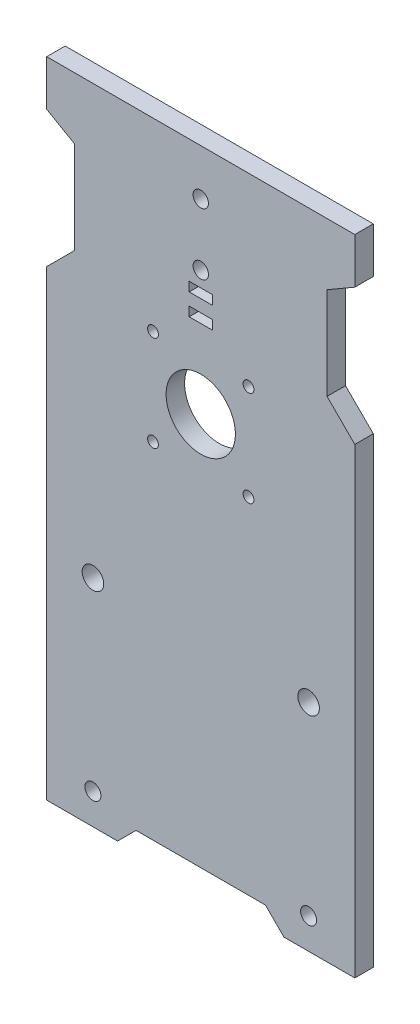
ISO-10303-21;
HEADER;
FILE_DESCRIPTION(('STEP AP214'),'2;1');
FILE_NAME('part.step','',(''),(''),'','','');
FILE_SCHEMA(('AUTOMOTIVE_DESIGN { 1 0 10303 214 1 1 1 1 }'));
ENDSEC;
DATA;
#1=APPLICATION_CONTEXT('core data for automotive mechanical design processes');
#2=APPLICATION_PROTOCOL_DEFINITION('international standard','automotive_design',2000,#1);
#3=PRODUCT_CONTEXT('',#1,'mechanical');
#4=PRODUCT('Part','Part','',(#3));
#5=PRODUCT_RELATED_PRODUCT_CATEGORY('part','',(#4));
#6=PRODUCT_DEFINITION_FORMATION('','',#4);
#7=PRODUCT_DEFINITION_CONTEXT('part definition',#1,'design');
#8=PRODUCT_DEFINITION('design','',#6,#7);
#9=PRODUCT_DEFINITION_SHAPE('','',#8);
#10=(LENGTH_UNIT() NAMED_UNIT(*) SI_UNIT(.MILLI.,.METRE.));
#11=(NAMED_UNIT(*) PLANE_ANGLE_UNIT() SI_UNIT($,.RADIAN.));
#12=(NAMED_UNIT(*) SI_UNIT($,.STERADIAN.) SOLID_ANGLE_UNIT());
#13=UNCERTAINTY_MEASURE_WITH_UNIT(LENGTH_MEASURE(1.E-05),#10,'distance_accuracy_value','');
#14=(GEOMETRIC_REPRESENTATION_CONTEXT(3) GLOBAL_UNCERTAINTY_ASSIGNED_CONTEXT((#13)) GLOBAL_UNIT_ASSIGNED_CONTEXT((#10,
#11,#12)) REPRESENTATION_CONTEXT('',''));
#15=CARTESIAN_POINT('',(0.,0.,0.));
#16=DIRECTION('',(0.,0.,1.));
#17=DIRECTION('',(1.,0.,0.));
#18=AXIS2_PLACEMENT_3D('',#15,#16,#17);
#19=CARTESIAN_POINT('',(0.,0.,6.));
#20=DIRECTION('',(0.,0.,-1.));
#21=DIRECTION('',(-1.,0.,0.));
#22=AXIS2_PLACEMENT_3D('',#19,#20,#21);
#23=PLANE('',#22);
#24=DIRECTION('',(0.,-1.,0.));
#25=VECTOR('',#24,1.);
#26=CARTESIAN_POINT('',(-3.75,54.5,6.));
#27=LINE('',#26,#25);
#28=CARTESIAN_POINT('',(-3.75,57.5,6.));
#29=VERTEX_POINT('',#28);
#30=CARTESIAN_POINT('',(-3.75,54.5,6.));
#31=VERTEX_POINT('',#30);
#32=EDGE_CURVE('E255',#29,#31,#27,.T.);
#33=ORIENTED_EDGE('',*,*,#32,.F.);
#34=DIRECTION('',(-1.,0.,0.));
#35=VECTOR('',#34,1.);
#36=CARTESIAN_POINT('',(-3.75,57.5,6.));
#37=LINE('',#36,#35);
#38=CARTESIAN_POINT('',(3.75,57.5,6.));
#39=VERTEX_POINT('',#38);
#40=EDGE_CURVE('E266',#39,#29,#37,.T.);
#41=ORIENTED_EDGE('',*,*,#40,.F.);
#42=DIRECTION('',(0.,1.,0.));
#43=VECTOR('',#42,1.);
#44=CARTESIAN_POINT('',(3.75,54.5,6.));
#45=LINE('',#44,#43);
#46=CARTESIAN_POINT('',(3.75,54.5,6.));
#47=VERTEX_POINT('',#46);
#48=EDGE_CURVE('E262',#47,#39,#45,.T.);
#49=ORIENTED_EDGE('',*,*,#48,.F.);
#50=DIRECTION('',(1.,0.,0.));
#51=VECTOR('',#50,1.);
#52=CARTESIAN_POINT('',(-3.75,54.5,6.));
#53=LINE('',#52,#51);
#54=EDGE_CURVE('E258',#31,#47,#53,.T.);
#55=ORIENTED_EDGE('',*,*,#54,.F.);
#56=EDGE_LOOP('',(#33,#41,#49,#55));
#57=FACE_BOUND('',#56,.T.);
#58=DIRECTION('',(1.,0.,0.));
#59=VECTOR('',#58,1.);
#60=CARTESIAN_POINT('',(-27.,-104.5,6.));
#61=LINE('',#60,#59);
#62=CARTESIAN_POINT('',(-50.,-104.5,6.));
#63=VERTEX_POINT('',#62);
#64=CARTESIAN_POINT('',(-27.,-104.5,6.));
#65=VERTEX_POINT('',#64);
#66=EDGE_CURVE('E369',#63,#65,#61,.T.);
#67=ORIENTED_EDGE('',*,*,#66,.T.);
#68=DIRECTION('',(0.707106781186547,0.707106781186548,0.));
#69=VECTOR('',#68,1.);
#70=CARTESIAN_POINT('',(-21.,-98.5,6.));
#71=LINE('',#70,#69);
#72=CARTESIAN_POINT('',(-21.,-98.5,6.));
#73=VERTEX_POINT('',#72);
#74=EDGE_CURVE('E373',#65,#73,#71,.T.);
#75=ORIENTED_EDGE('',*,*,#74,.T.);
#76=DIRECTION('',(1.,0.,0.));
#77=VECTOR('',#76,1.);
#78=CARTESIAN_POINT('',(21.,-98.5,6.));
#79=LINE('',#78,#77);
#80=CARTESIAN_POINT('',(21.,-98.5,6.));
#81=VERTEX_POINT('',#80);
#82=EDGE_CURVE('E377',#73,#81,#79,.T.);
#83=ORIENTED_EDGE('',*,*,#82,.T.);
#84=DIRECTION('',(0.707106781186547,-0.707106781186547,0.));
#85=VECTOR('',#84,1.);
#86=CARTESIAN_POINT('',(27.,-104.5,6.));
#87=LINE('',#86,#85);
#88=CARTESIAN_POINT('',(27.,-104.5,6.));
#89=VERTEX_POINT('',#88);
#90=EDGE_CURVE('E380',#81,#89,#87,.T.);
#91=ORIENTED_EDGE('',*,*,#90,.T.);
#92=DIRECTION('',(1.,0.,0.));
#93=VECTOR('',#92,1.);
#94=CARTESIAN_POINT('',(50.,-104.5,6.));
#95=LINE('',#94,#93);
#96=CARTESIAN_POINT('',(50.,-104.5,6.));
#97=VERTEX_POINT('',#96);
#98=EDGE_CURVE('E383',#89,#97,#95,.T.);
#99=ORIENTED_EDGE('',*,*,#98,.T.);
#100=DIRECTION('',(0.,1.,0.));
#101=VECTOR('',#100,1.);
#102=CARTESIAN_POINT('',(50.,45.5,6.));
#103=LINE('',#102,#101);
#104=CARTESIAN_POINT('',(50.,45.5,6.));
#105=VERTEX_POINT('',#104);
#106=EDGE_CURVE('E386',#97,#105,#103,.T.);
#107=ORIENTED_EDGE('',*,*,#106,.T.);
#108=DIRECTION('',(-0.707106781186547,0.707106781186548,0.));
#109=VECTOR('',#108,1.);
#110=CARTESIAN_POINT('',(41.,54.5,6.));
#111=LINE('',#110,#109);
#112=CARTESIAN_POINT('',(41.,54.5,6.));
#113=VERTEX_POINT('',#112);
#114=EDGE_CURVE('E389',#105,#113,#111,.T.);
#115=ORIENTED_EDGE('',*,*,#114,.T.);
#116=DIRECTION('',(0.,1.,0.));
#117=VECTOR('',#116,1.);
#118=CARTESIAN_POINT('',(41.,84.5,6.));
#119=LINE('',#118,#117);
#120=CARTESIAN_POINT('',(41.,84.5,6.));
#121=VERTEX_POINT('',#120);
#122=EDGE_CURVE('E391',#113,#121,#119,.T.);
#123=ORIENTED_EDGE('',*,*,#122,.T.);
#124=DIRECTION('',(0.86602540378444,0.499999999999998,0.));
#125=VECTOR('',#124,1.);
#126=CARTESIAN_POINT('',(50.,89.6961524227066,6.));
#127=LINE('',#126,#125);
#128=CARTESIAN_POINT('',(50.,89.6961524227066,6.));
#129=VERTEX_POINT('',#128);
#130=EDGE_CURVE('E394',#121,#129,#127,.T.);
#131=ORIENTED_EDGE('',*,*,#130,.T.);
#132=DIRECTION('',(0.,1.,0.));
#133=VECTOR('',#132,1.);
#134=CARTESIAN_POINT('',(50.,104.5,6.));
#135=LINE('',#134,#133);
#136=CARTESIAN_POINT('',(50.,104.5,6.));
#137=VERTEX_POINT('',#136);
#138=EDGE_CURVE('E397',#129,#137,#135,.T.);
#139=ORIENTED_EDGE('',*,*,#138,.T.);
#140=DIRECTION('',(-1.,0.,0.));
#141=VECTOR('',#140,1.);
#142=CARTESIAN_POINT('',(-50.,104.5,6.));
#143=LINE('',#142,#141);
#144=CARTESIAN_POINT('',(-50.,104.5,6.));
#145=VERTEX_POINT('',#144);
#146=EDGE_CURVE('E400',#137,#145,#143,.T.);
#147=ORIENTED_EDGE('',*,*,#146,.T.);
#148=DIRECTION('',(0.,-1.,0.));
#149=VECTOR('',#148,1.);
#150=CARTESIAN_POINT('',(-50.,89.6961524227066,6.));
#151=LINE('',#150,#149);
#152=CARTESIAN_POINT('',(-50.,89.6961524227066,6.));
#153=VERTEX_POINT('',#152);
#154=EDGE_CURVE('E403',#145,#153,#151,.T.);
#155=ORIENTED_EDGE('',*,*,#154,.T.);
#156=DIRECTION('',(0.866025403784438,-0.500000000000001,0.));
#157=VECTOR('',#156,1.);
#158=CARTESIAN_POINT('',(-41.,84.5,6.));
#159=LINE('',#158,#157);
#160=CARTESIAN_POINT('',(-41.,84.5,6.));
#161=VERTEX_POINT('',#160);
#162=EDGE_CURVE('E406',#153,#161,#159,.T.);
#163=ORIENTED_EDGE('',*,*,#162,.T.);
#164=DIRECTION('',(0.,-1.,0.));
#165=VECTOR('',#164,1.);
#166=CARTESIAN_POINT('',(-41.,54.5,6.));
#167=LINE('',#166,#165);
#168=CARTESIAN_POINT('',(-41.,54.5,6.));
#169=VERTEX_POINT('',#168);
#170=EDGE_CURVE('E409',#161,#169,#167,.T.);
#171=ORIENTED_EDGE('',*,*,#170,.T.);
#172=DIRECTION('',(-0.707106781186547,-0.707106781186548,0.));
#173=VECTOR('',#172,1.);
#174=CARTESIAN_POINT('',(-50.,45.5,6.));
#175=LINE('',#174,#173);
#176=CARTESIAN_POINT('',(-50.,45.5,6.));
#177=VERTEX_POINT('',#176);
#178=EDGE_CURVE('E412',#169,#177,#175,.T.);
#179=ORIENTED_EDGE('',*,*,#178,.T.);
#180=DIRECTION('',(0.,-1.,0.));
#181=VECTOR('',#180,1.);
#182=CARTESIAN_POINT('',(-50.,-104.5,6.));
#183=LINE('',#182,#181);
#184=EDGE_CURVE('E415',#177,#63,#183,.T.);
#185=ORIENTED_EDGE('',*,*,#184,.T.);
#186=EDGE_LOOP('',(#67,#75,#83,#91,#99,#107,#115,#123,#131,#139,#147,#155,#163,#171,#179,#185));
#187=FACE_BOUND('',#186,.T.);
#188=CARTESIAN_POINT('',(-35.,-94.5,6.));
#189=DIRECTION('',(0.,0.,1.));
#190=DIRECTION('',(1.,0.,0.));
#191=AXIS2_PLACEMENT_3D('',#188,#189,#190);
#192=CIRCLE('',#191,2.6);
#193=CARTESIAN_POINT('',(-32.4,-94.5,6.));
#194=VERTEX_POINT('',#193);
#195=EDGE_CURVE('E361',#194,#194,#192,.T.);
#196=ORIENTED_EDGE('',*,*,#195,.F.);
#197=EDGE_LOOP('',(#196));
#198=FACE_BOUND('',#197,.T.);
#199=CARTESIAN_POINT('',(-35.,-34.5,6.));
#200=DIRECTION('',(0.,0.,1.));
#201=DIRECTION('',(1.,0.,0.));
#202=AXIS2_PLACEMENT_3D('',#199,#200,#201);
#203=CIRCLE('',#202,3.5);
#204=CARTESIAN_POINT('',(-31.5,-34.5,6.));
#205=VERTEX_POINT('',#204);
#206=EDGE_CURVE('E353',#205,#205,#203,.T.);
#207=ORIENTED_EDGE('',*,*,#206,.F.);
#208=EDGE_LOOP('',(#207));
#209=FACE_BOUND('',#208,.T.);
#210=CARTESIAN_POINT('',(35.,-34.5,6.));
#211=DIRECTION('',(0.,0.,1.));
#212=DIRECTION('',(1.,0.,0.));
#213=AXIS2_PLACEMENT_3D('',#210,#211,#212);
#214=CIRCLE('',#213,3.50000000000001);
#215=CARTESIAN_POINT('',(38.5,-34.5,6.));
#216=VERTEX_POINT('',#215);
#217=EDGE_CURVE('E345',#216,#216,#214,.T.);
#218=ORIENTED_EDGE('',*,*,#217,.F.);
#219=EDGE_LOOP('',(#218));
#220=FACE_BOUND('',#219,.T.);
#221=CARTESIAN_POINT('',(35.,-94.5,6.));
#222=DIRECTION('',(0.,0.,1.));
#223=DIRECTION('',(1.,0.,0.));
#224=AXIS2_PLACEMENT_3D('',#221,#222,#223);
#225=CIRCLE('',#224,2.6);
#226=CARTESIAN_POINT('',(37.6,-94.5,6.));
#227=VERTEX_POINT('',#226);
#228=EDGE_CURVE('E337',#227,#227,#225,.T.);
#229=ORIENTED_EDGE('',*,*,#228,.F.);
#230=EDGE_LOOP('',(#229));
#231=FACE_BOUND('',#230,.T.);
#232=CARTESIAN_POINT('',(-15.5,13.5,6.));
#233=DIRECTION('',(0.,0.,1.));
#234=DIRECTION('',(1.,0.,0.));
#235=AXIS2_PLACEMENT_3D('',#232,#233,#234);
#236=CIRCLE('',#235,1.75);
#237=CARTESIAN_POINT('',(-13.75,13.5,6.));
#238=VERTEX_POINT('',#237);
#239=EDGE_CURVE('E329',#238,#238,#236,.T.);
#240=ORIENTED_EDGE('',*,*,#239,.F.);
#241=EDGE_LOOP('',(#240));
#242=FACE_BOUND('',#241,.T.);
#243=CARTESIAN_POINT('',(15.5,13.5,6.));
#244=DIRECTION('',(0.,0.,1.));
#245=DIRECTION('',(1.,0.,0.));
#246=AXIS2_PLACEMENT_3D('',#243,#244,#245);
#247=CIRCLE('',#246,1.75000000000001);
#248=CARTESIAN_POINT('',(17.25,13.5,6.));
#249=VERTEX_POINT('',#248);
#250=EDGE_CURVE('E321',#249,#249,#247,.T.);
#251=ORIENTED_EDGE('',*,*,#250,.F.);
#252=EDGE_LOOP('',(#251));
#253=FACE_BOUND('',#252,.T.);
#254=CARTESIAN_POINT('',(0.,29.,6.));
#255=DIRECTION('',(0.,0.,1.));
#256=DIRECTION('',(1.,0.,0.));
#257=AXIS2_PLACEMENT_3D('',#254,#255,#256);
#258=CIRCLE('',#257,11.25);
#259=CARTESIAN_POINT('',(11.25,29.,6.));
#260=VERTEX_POINT('',#259);
#261=EDGE_CURVE('E314',#260,#260,#258,.T.);
#262=ORIENTED_EDGE('',*,*,#261,.F.);
#263=EDGE_LOOP('',(#262));
#264=FACE_BOUND('',#263,.T.);
#265=CARTESIAN_POINT('',(15.5,44.5,6.));
#266=DIRECTION('',(0.,0.,1.));
#267=DIRECTION('',(1.,0.,0.));
#268=AXIS2_PLACEMENT_3D('',#265,#266,#267);
#269=CIRCLE('',#268,1.75000000000001);
#270=CARTESIAN_POINT('',(17.25,44.5,6.));
#271=VERTEX_POINT('',#270);
#272=EDGE_CURVE('E306',#271,#271,#269,.T.);
#273=ORIENTED_EDGE('',*,*,#272,.F.);
#274=EDGE_LOOP('',(#273));
#275=FACE_BOUND('',#274,.T.);
#276=CARTESIAN_POINT('',(-15.5,44.5,6.));
#277=DIRECTION('',(0.,0.,1.));
#278=DIRECTION('',(1.,0.,0.));
#279=AXIS2_PLACEMENT_3D('',#276,#277,#278);
#280=CIRCLE('',#279,1.75);
#281=CARTESIAN_POINT('',(-13.75,44.5,6.));
#282=VERTEX_POINT('',#281);
#283=EDGE_CURVE('E298',#282,#282,#280,.T.);
#284=ORIENTED_EDGE('',*,*,#283,.F.);
#285=EDGE_LOOP('',(#284));
#286=FACE_BOUND('',#285,.T.);
#287=DIRECTION('',(0.,-1.,0.));
#288=VECTOR('',#287,1.);
#289=CARTESIAN_POINT('',(-3.75,61.5,6.));
#290=LINE('',#289,#288);
#291=CARTESIAN_POINT('',(-3.75,64.5,6.));
#292=VERTEX_POINT('',#291);
#293=CARTESIAN_POINT('',(-3.75,61.5,6.));
#294=VERTEX_POINT('',#293);
#295=EDGE_CURVE('E202',#292,#294,#290,.T.);
#296=ORIENTED_EDGE('',*,*,#295,.F.);
#297=DIRECTION('',(-1.,0.,0.));
#298=VECTOR('',#297,1.);
#299=CARTESIAN_POINT('',(-3.75,64.5,6.));
#300=LINE('',#299,#298);
#301=CARTESIAN_POINT('',(3.75,64.5,6.));
#302=VERTEX_POINT('',#301);
#303=EDGE_CURVE('E231',#302,#292,#300,.T.);
#304=ORIENTED_EDGE('',*,*,#303,.F.);
#305=DIRECTION('',(0.,1.,0.));
#306=VECTOR('',#305,1.);
#307=CARTESIAN_POINT('',(3.75,61.5,6.));
#308=LINE('',#307,#306);
#309=CARTESIAN_POINT('',(3.75,61.5,6.));
#310=VERTEX_POINT('',#309);
#311=EDGE_CURVE('E225',#310,#302,#308,.T.);
#312=ORIENTED_EDGE('',*,*,#311,.F.);
#313=DIRECTION('',(1.,0.,0.));
#314=VECTOR('',#313,1.);
#315=CARTESIAN_POINT('',(-3.75,61.5,6.));
#316=LINE('',#315,#314);
#317=EDGE_CURVE('E211',#294,#310,#316,.T.);
#318=ORIENTED_EDGE('',*,*,#317,.F.);
#319=EDGE_LOOP('',(#296,#304,#312,#318));
#320=FACE_BOUND('',#319,.T.);
#321=CARTESIAN_POINT('',(0.,69.5,6.));
#322=DIRECTION('',(0.,0.,1.));
#323=DIRECTION('',(1.,0.,0.));
#324=AXIS2_PLACEMENT_3D('',#321,#322,#323);
#325=CIRCLE('',#324,2.5);
#326=CARTESIAN_POINT('',(2.5,69.5,6.));
#327=VERTEX_POINT('',#326);
#328=EDGE_CURVE('E239',#327,#327,#325,.T.);
#329=ORIENTED_EDGE('',*,*,#328,.F.);
#330=EDGE_LOOP('',(#329));
#331=FACE_BOUND('',#330,.T.);
#332=CARTESIAN_POINT('',(0.,89.5,6.));
#333=DIRECTION('',(0.,0.,1.));
#334=DIRECTION('',(1.,0.,0.));
#335=AXIS2_PLACEMENT_3D('',#332,#333,#334);
#336=CIRCLE('',#335,2.5);
#337=CARTESIAN_POINT('',(2.5,89.5,6.));
#338=VERTEX_POINT('',#337);
#339=EDGE_CURVE('E804',#338,#338,#336,.T.);
#340=ORIENTED_EDGE('',*,*,#339,.F.);
#341=EDGE_LOOP('',(#340));
#342=FACE_BOUND('',#341,.T.);
#343=ADVANCED_FACE('F40',(#57,#187,#198,#209,#220,#231,#242,#253,#264,#275,#286,#320,#331,#342),
#23,.F.);
#344=CARTESIAN_POINT('',(0.,0.,0.));
#345=DIRECTION('',(0.,0.,-1.));
#346=DIRECTION('',(-1.,0.,0.));
#347=AXIS2_PLACEMENT_3D('',#344,#345,#346);
#348=PLANE('',#347);
#349=CARTESIAN_POINT('',(0.,69.5,0.));
#350=DIRECTION('',(0.,0.,1.));
#351=DIRECTION('',(1.,0.,0.));
#352=AXIS2_PLACEMENT_3D('',#349,#350,#351);
#353=CIRCLE('',#352,2.5);
#354=CARTESIAN_POINT('',(2.5,69.5,0.));
#355=VERTEX_POINT('',#354);
#356=EDGE_CURVE('E808',#355,#355,#353,.T.);
#357=ORIENTED_EDGE('',*,*,#356,.T.);
#358=EDGE_LOOP('',(#357));
#359=FACE_BOUND('',#358,.T.);
#360=CARTESIAN_POINT('',(15.5,44.5,0.));
#361=DIRECTION('',(0.,0.,1.));
#362=DIRECTION('',(1.,0.,0.));
#363=AXIS2_PLACEMENT_3D('',#360,#361,#362);
#364=CIRCLE('',#363,1.75000000000001);
#365=CARTESIAN_POINT('',(17.25,44.5,0.));
#366=VERTEX_POINT('',#365);
#367=EDGE_CURVE('E302',#366,#366,#364,.T.);
#368=ORIENTED_EDGE('',*,*,#367,.T.);
#369=EDGE_LOOP('',(#368));
#370=FACE_BOUND('',#369,.T.);
#371=CARTESIAN_POINT('',(15.5,13.5,0.));
#372=DIRECTION('',(0.,0.,1.));
#373=DIRECTION('',(1.,0.,0.));
#374=AXIS2_PLACEMENT_3D('',#371,#372,#373);
#375=CIRCLE('',#374,1.75000000000001);
#376=CARTESIAN_POINT('',(17.25,13.5,0.));
#377=VERTEX_POINT('',#376);
#378=EDGE_CURVE('E318',#377,#377,#375,.T.);
#379=ORIENTED_EDGE('',*,*,#378,.T.);
#380=EDGE_LOOP('',(#379));
#381=FACE_BOUND('',#380,.T.);
#382=CARTESIAN_POINT('',(35.,-94.5,0.));
#383=DIRECTION('',(0.,0.,1.));
#384=DIRECTION('',(1.,0.,0.));
#385=AXIS2_PLACEMENT_3D('',#382,#383,#384);
#386=CIRCLE('',#385,2.6);
#387=CARTESIAN_POINT('',(37.6,-94.5,0.));
#388=VERTEX_POINT('',#387);
#389=EDGE_CURVE('E333',#388,#388,#386,.T.);
#390=ORIENTED_EDGE('',*,*,#389,.T.);
#391=EDGE_LOOP('',(#390));
#392=FACE_BOUND('',#391,.T.);
#393=CARTESIAN_POINT('',(-35.,-34.5,0.));
#394=DIRECTION('',(0.,0.,1.));
#395=DIRECTION('',(1.,0.,0.));
#396=AXIS2_PLACEMENT_3D('',#393,#394,#395);
#397=CIRCLE('',#396,3.5);
#398=CARTESIAN_POINT('',(-31.5,-34.5,0.));
#399=VERTEX_POINT('',#398);
#400=EDGE_CURVE('E349',#399,#399,#397,.T.);
#401=ORIENTED_EDGE('',*,*,#400,.T.);
#402=EDGE_LOOP('',(#401));
#403=FACE_BOUND('',#402,.T.);
#404=DIRECTION('',(1.,0.,0.));
#405=VECTOR('',#404,1.);
#406=CARTESIAN_POINT('',(-27.,-104.5,0.));
#407=LINE('',#406,#405);
#408=CARTESIAN_POINT('',(-50.,-104.5,0.));
#409=VERTEX_POINT('',#408);
#410=CARTESIAN_POINT('',(-27.,-104.5,0.));
#411=VERTEX_POINT('',#410);
#412=EDGE_CURVE('E365',#409,#411,#407,.T.);
#413=ORIENTED_EDGE('',*,*,#412,.F.);
#414=DIRECTION('',(0.,-1.,0.));
#415=VECTOR('',#414,1.);
#416=CARTESIAN_POINT('',(-50.,-104.5,0.));
#417=LINE('',#416,#415);
#418=CARTESIAN_POINT('',(-50.,45.5,0.));
#419=VERTEX_POINT('',#418);
#420=EDGE_CURVE('E374',#419,#409,#417,.T.);
#421=ORIENTED_EDGE('',*,*,#420,.F.);
#422=DIRECTION('',(-0.707106781186547,-0.707106781186548,0.));
#423=VECTOR('',#422,1.);
#424=CARTESIAN_POINT('',(-50.,45.5,0.));
#425=LINE('',#424,#423);
#426=CARTESIAN_POINT('',(-41.,54.5,0.));
#427=VERTEX_POINT('',#426);
#428=EDGE_CURVE('E461',#427,#419,#425,.T.);
#429=ORIENTED_EDGE('',*,*,#428,.F.);
#430=DIRECTION('',(0.,-1.,0.));
#431=VECTOR('',#430,1.);
#432=CARTESIAN_POINT('',(-41.,54.5,0.));
#433=LINE('',#432,#431);
#434=CARTESIAN_POINT('',(-41.,84.5,0.));
#435=VERTEX_POINT('',#434);
#436=EDGE_CURVE('E458',#435,#427,#433,.T.);
#437=ORIENTED_EDGE('',*,*,#436,.F.);
#438=DIRECTION('',(0.866025403784438,-0.500000000000001,0.));
#439=VECTOR('',#438,1.);
#440=CARTESIAN_POINT('',(-41.,84.5,0.));
#441=LINE('',#440,#439);
#442=CARTESIAN_POINT('',(-50.,89.6961524227066,0.));
#443=VERTEX_POINT('',#442);
#444=EDGE_CURVE('E455',#443,#435,#441,.T.);
#445=ORIENTED_EDGE('',*,*,#444,.F.);
#446=DIRECTION('',(0.,-1.,0.));
#447=VECTOR('',#446,1.);
#448=CARTESIAN_POINT('',(-50.,89.6961524227066,0.));
#449=LINE('',#448,#447);
#450=CARTESIAN_POINT('',(-50.,104.5,0.));
#451=VERTEX_POINT('',#450);
#452=EDGE_CURVE('E452',#451,#443,#449,.T.);
#453=ORIENTED_EDGE('',*,*,#452,.F.);
#454=DIRECTION('',(-1.,0.,0.));
#455=VECTOR('',#454,1.);
#456=CARTESIAN_POINT('',(-50.,104.5,0.));
#457=LINE('',#456,#455);
#458=CARTESIAN_POINT('',(50.,104.5,0.));
#459=VERTEX_POINT('',#458);
#460=EDGE_CURVE('E449',#459,#451,#457,.T.);
#461=ORIENTED_EDGE('',*,*,#460,.F.);
#462=DIRECTION('',(0.,1.,0.));
#463=VECTOR('',#462,1.);
#464=CARTESIAN_POINT('',(50.,104.5,0.));
#465=LINE('',#464,#463);
#466=CARTESIAN_POINT('',(50.,89.6961524227066,0.));
#467=VERTEX_POINT('',#466);
#468=EDGE_CURVE('E446',#467,#459,#465,.T.);
#469=ORIENTED_EDGE('',*,*,#468,.F.);
#470=DIRECTION('',(0.86602540378444,0.499999999999998,0.));
#471=VECTOR('',#470,1.);
#472=CARTESIAN_POINT('',(50.,89.6961524227066,0.));
#473=LINE('',#472,#471);
#474=CARTESIAN_POINT('',(41.,84.5,0.));
#475=VERTEX_POINT('',#474);
#476=EDGE_CURVE('E443',#475,#467,#473,.T.);
#477=ORIENTED_EDGE('',*,*,#476,.F.);
#478=DIRECTION('',(0.,1.,0.));
#479=VECTOR('',#478,1.);
#480=CARTESIAN_POINT('',(41.,84.5,0.));
#481=LINE('',#480,#479);
#482=CARTESIAN_POINT('',(41.,54.5,0.));
#483=VERTEX_POINT('',#482);
#484=EDGE_CURVE('E440',#483,#475,#481,.T.);
#485=ORIENTED_EDGE('',*,*,#484,.F.);
#486=DIRECTION('',(-0.707106781186547,0.707106781186548,0.));
#487=VECTOR('',#486,1.);
#488=CARTESIAN_POINT('',(41.,54.5,0.));
#489=LINE('',#488,#487);
#490=CARTESIAN_POINT('',(50.,45.5,0.));
#491=VERTEX_POINT('',#490);
#492=EDGE_CURVE('E437',#491,#483,#489,.T.);
#493=ORIENTED_EDGE('',*,*,#492,.F.);
#494=DIRECTION('',(0.,1.,0.));
#495=VECTOR('',#494,1.);
#496=CARTESIAN_POINT('',(50.,45.5,0.));
#497=LINE('',#496,#495);
#498=CARTESIAN_POINT('',(50.,-104.5,0.));
#499=VERTEX_POINT('',#498);
#500=EDGE_CURVE('E434',#499,#491,#497,.T.);
#501=ORIENTED_EDGE('',*,*,#500,.F.);
#502=DIRECTION('',(1.,0.,0.));
#503=VECTOR('',#502,1.);
#504=CARTESIAN_POINT('',(50.,-104.5,0.));
#505=LINE('',#504,#503);
#506=CARTESIAN_POINT('',(27.,-104.5,0.));
#507=VERTEX_POINT('',#506);
#508=EDGE_CURVE('E431',#507,#499,#505,.T.);
#509=ORIENTED_EDGE('',*,*,#508,.F.);
#510=DIRECTION('',(0.707106781186547,-0.707106781186547,0.));
#511=VECTOR('',#510,1.);
#512=CARTESIAN_POINT('',(27.,-104.5,0.));
#513=LINE('',#512,#511);
#514=CARTESIAN_POINT('',(21.,-98.5,0.));
#515=VERTEX_POINT('',#514);
#516=EDGE_CURVE('E428',#515,#507,#513,.T.);
#517=ORIENTED_EDGE('',*,*,#516,.F.);
#518=DIRECTION('',(1.,0.,0.));
#519=VECTOR('',#518,1.);
#520=CARTESIAN_POINT('',(21.,-98.5,0.));
#521=LINE('',#520,#519);
#522=CARTESIAN_POINT('',(-21.,-98.5,0.));
#523=VERTEX_POINT('',#522);
#524=EDGE_CURVE('E425',#523,#515,#521,.T.);
#525=ORIENTED_EDGE('',*,*,#524,.F.);
#526=DIRECTION('',(0.707106781186547,0.707106781186548,0.));
#527=VECTOR('',#526,1.);
#528=CARTESIAN_POINT('',(-21.,-98.5,0.));
#529=LINE('',#528,#527);
#530=EDGE_CURVE('E422',#411,#523,#529,.T.);
#531=ORIENTED_EDGE('',*,*,#530,.F.);
#532=EDGE_LOOP('',(#413,#421,#429,#437,#445,#453,#461,#469,#477,#485,#493,#501,#509,#517,#525,#531));
#533=FACE_BOUND('',#532,.T.);
#534=CARTESIAN_POINT('',(-35.,-94.5,0.));
#535=DIRECTION('',(0.,0.,1.));
#536=DIRECTION('',(1.,0.,0.));
#537=AXIS2_PLACEMENT_3D('',#534,#535,#536);
#538=CIRCLE('',#537,2.6);
#539=CARTESIAN_POINT('',(-32.4,-94.5,0.));
#540=VERTEX_POINT('',#539);
#541=EDGE_CURVE('E357',#540,#540,#538,.T.);
#542=ORIENTED_EDGE('',*,*,#541,.T.);
#543=EDGE_LOOP('',(#542));
#544=FACE_BOUND('',#543,.T.);
#545=CARTESIAN_POINT('',(35.,-34.5,0.));
#546=DIRECTION('',(0.,0.,1.));
#547=DIRECTION('',(1.,0.,0.));
#548=AXIS2_PLACEMENT_3D('',#545,#546,#547);
#549=CIRCLE('',#548,3.50000000000001);
#550=CARTESIAN_POINT('',(38.5,-34.5,0.));
#551=VERTEX_POINT('',#550);
#552=EDGE_CURVE('E341',#551,#551,#549,.T.);
#553=ORIENTED_EDGE('',*,*,#552,.T.);
#554=EDGE_LOOP('',(#553));
#555=FACE_BOUND('',#554,.T.);
#556=CARTESIAN_POINT('',(-15.5,13.5,0.));
#557=DIRECTION('',(0.,0.,1.));
#558=DIRECTION('',(1.,0.,0.));
#559=AXIS2_PLACEMENT_3D('',#556,#557,#558);
#560=CIRCLE('',#559,1.75);
#561=CARTESIAN_POINT('',(-13.75,13.5,0.));
#562=VERTEX_POINT('',#561);
#563=EDGE_CURVE('E325',#562,#562,#560,.T.);
#564=ORIENTED_EDGE('',*,*,#563,.T.);
#565=EDGE_LOOP('',(#564));
#566=FACE_BOUND('',#565,.T.);
#567=CARTESIAN_POINT('',(0.,29.,0.));
#568=DIRECTION('',(0.,0.,1.));
#569=DIRECTION('',(1.,0.,0.));
#570=AXIS2_PLACEMENT_3D('',#567,#568,#569);
#571=CIRCLE('',#570,11.25);
#572=CARTESIAN_POINT('',(11.25,29.,0.));
#573=VERTEX_POINT('',#572);
#574=EDGE_CURVE('E310',#573,#573,#571,.T.);
#575=ORIENTED_EDGE('',*,*,#574,.T.);
#576=EDGE_LOOP('',(#575));
#577=FACE_BOUND('',#576,.T.);
#578=CARTESIAN_POINT('',(-15.5,44.5,0.));
#579=DIRECTION('',(0.,0.,1.));
#580=DIRECTION('',(1.,0.,0.));
#581=AXIS2_PLACEMENT_3D('',#578,#579,#580);
#582=CIRCLE('',#581,1.75);
#583=CARTESIAN_POINT('',(-13.75,44.5,0.));
#584=VERTEX_POINT('',#583);
#585=EDGE_CURVE('E297',#584,#584,#582,.T.);
#586=ORIENTED_EDGE('',*,*,#585,.T.);
#587=EDGE_LOOP('',(#586));
#588=FACE_BOUND('',#587,.T.);
#589=DIRECTION('',(-1.,0.,0.));
#590=VECTOR('',#589,1.);
#591=CARTESIAN_POINT('',(-3.75,57.5,0.));
#592=LINE('',#591,#590);
#593=CARTESIAN_POINT('',(3.75,57.5,0.));
#594=VERTEX_POINT('',#593);
#595=CARTESIAN_POINT('',(-3.75,57.5,0.));
#596=VERTEX_POINT('',#595);
#597=EDGE_CURVE('E259',#594,#596,#592,.T.);
#598=ORIENTED_EDGE('',*,*,#597,.T.);
#599=DIRECTION('',(0.,-1.,0.));
#600=VECTOR('',#599,1.);
#601=CARTESIAN_POINT('',(-3.75,54.5,0.));
#602=LINE('',#601,#600);
#603=CARTESIAN_POINT('',(-3.75,54.5,0.));
#604=VERTEX_POINT('',#603);
#605=EDGE_CURVE('E220',#596,#604,#602,.T.);
#606=ORIENTED_EDGE('',*,*,#605,.T.);
#607=DIRECTION('',(1.,0.,0.));
#608=VECTOR('',#607,1.);
#609=CARTESIAN_POINT('',(-3.75,54.5,0.));
#610=LINE('',#609,#608);
#611=CARTESIAN_POINT('',(3.75,54.5,0.));
#612=VERTEX_POINT('',#611);
#613=EDGE_CURVE('E273',#604,#612,#610,.T.);
#614=ORIENTED_EDGE('',*,*,#613,.T.);
#615=DIRECTION('',(0.,1.,0.));
#616=VECTOR('',#615,1.);
#617=CARTESIAN_POINT('',(3.75,54.5,0.));
#618=LINE('',#617,#616);
#619=EDGE_CURVE('E277',#612,#594,#618,.T.);
#620=ORIENTED_EDGE('',*,*,#619,.T.);
#621=EDGE_LOOP('',(#598,#606,#614,#620));
#622=FACE_BOUND('',#621,.T.);
#623=DIRECTION('',(-1.,0.,0.));
#624=VECTOR('',#623,1.);
#625=CARTESIAN_POINT('',(-3.75,64.5,0.));
#626=LINE('',#625,#624);
#627=CARTESIAN_POINT('',(3.75,64.5,0.));
#628=VERTEX_POINT('',#627);
#629=CARTESIAN_POINT('',(-3.75,64.5,0.));
#630=VERTEX_POINT('',#629);
#631=EDGE_CURVE('E212',#628,#630,#626,.T.);
#632=ORIENTED_EDGE('',*,*,#631,.T.);
#633=DIRECTION('',(0.,-1.,0.));
#634=VECTOR('',#633,1.);
#635=CARTESIAN_POINT('',(-3.75,61.5,0.));
#636=LINE('',#635,#634);
#637=CARTESIAN_POINT('',(-3.75,61.5,0.));
#638=VERTEX_POINT('',#637);
#639=EDGE_CURVE('E64',#630,#638,#636,.T.);
#640=ORIENTED_EDGE('',*,*,#639,.T.);
#641=DIRECTION('',(1.,0.,0.));
#642=VECTOR('',#641,1.);
#643=CARTESIAN_POINT('',(-3.75,61.5,0.));
#644=LINE('',#643,#642);
#645=CARTESIAN_POINT('',(3.75,61.5,0.));
#646=VERTEX_POINT('',#645);
#647=EDGE_CURVE('E218',#638,#646,#644,.T.);
#648=ORIENTED_EDGE('',*,*,#647,.T.);
#649=DIRECTION('',(0.,1.,0.));
#650=VECTOR('',#649,1.);
#651=CARTESIAN_POINT('',(3.75,61.5,0.));
#652=LINE('',#651,#650);
#653=EDGE_CURVE('E242',#646,#628,#652,.T.);
#654=ORIENTED_EDGE('',*,*,#653,.T.);
#655=EDGE_LOOP('',(#632,#640,#648,#654));
#656=FACE_BOUND('',#655,.T.);
#657=CARTESIAN_POINT('',(0.,89.5,0.));
#658=DIRECTION('',(0.,0.,1.));
#659=DIRECTION('',(1.,0.,0.));
#660=AXIS2_PLACEMENT_3D('',#657,#658,#659);
#661=CIRCLE('',#660,2.5);
#662=CARTESIAN_POINT('',(2.5,89.5,0.));
#663=VERTEX_POINT('',#662);
#664=EDGE_CURVE('E809',#663,#663,#661,.T.);
#665=ORIENTED_EDGE('',*,*,#664,.T.);
#666=EDGE_LOOP('',(#665));
#667=FACE_BOUND('',#666,.T.);
#668=ADVANCED_FACE('F532',(#359,#370,#381,#392,#403,#533,#544,#555,#566,#577,#588,#622,#656,
#667),#348,.T.);
#669=CARTESIAN_POINT('',(-27.,-104.5,6.));
#670=DIRECTION('',(0.,1.,0.));
#671=DIRECTION('',(0.,0.,1.));
#672=AXIS2_PLACEMENT_3D('',#669,#670,#671);
#673=PLANE('',#672);
#674=ORIENTED_EDGE('',*,*,#412,.T.);
#675=DIRECTION('',(0.,0.,-1.));
#676=VECTOR('',#675,1.);
#677=CARTESIAN_POINT('',(-27.,-104.5,6.));
#678=LINE('',#677,#676);
#679=EDGE_CURVE('E11',#65,#411,#678,.T.);
#680=ORIENTED_EDGE('',*,*,#679,.F.);
#681=ORIENTED_EDGE('',*,*,#66,.F.);
#682=DIRECTION('',(0.,0.,-1.));
#683=VECTOR('',#682,1.);
#684=CARTESIAN_POINT('',(-50.,-104.5,6.));
#685=LINE('',#684,#683);
#686=EDGE_CURVE('E418',#63,#409,#685,.T.);
#687=ORIENTED_EDGE('',*,*,#686,.T.);
#688=EDGE_LOOP('',(#674,#680,#681,#687));
#689=FACE_BOUND('',#688,.T.);
#690=ADVANCED_FACE('F42',(#689),#673,.F.);
#691=CARTESIAN_POINT('',(-21.,-98.5,6.));
#692=DIRECTION('',(-0.707106781186548,0.707106781186547,0.));
#693=DIRECTION('',(-0.707106781186547,-0.707106781186548,0.));
#694=AXIS2_PLACEMENT_3D('',#691,#692,#693);
#695=PLANE('',#694);
#696=ORIENTED_EDGE('',*,*,#530,.T.);
#697=DIRECTION('',(0.,0.,-1.));
#698=VECTOR('',#697,1.);
#699=CARTESIAN_POINT('',(-21.,-98.5,6.));
#700=LINE('',#699,#698);
#701=EDGE_CURVE('E49',#73,#523,#700,.T.);
#702=ORIENTED_EDGE('',*,*,#701,.F.);
#703=ORIENTED_EDGE('',*,*,#74,.F.);
#704=ORIENTED_EDGE('',*,*,#679,.T.);
#705=EDGE_LOOP('',(#696,#702,#703,#704));
#706=FACE_BOUND('',#705,.T.);
#707=ADVANCED_FACE('F550',(#706),#695,.F.);
#708=CARTESIAN_POINT('',(21.,-98.5,6.));
#709=DIRECTION('',(0.,1.,0.));
#710=DIRECTION('',(0.,0.,1.));
#711=AXIS2_PLACEMENT_3D('',#708,#709,#710);
#712=PLANE('',#711);
#713=ORIENTED_EDGE('',*,*,#524,.T.);
#714=DIRECTION('',(0.,0.,-1.));
#715=VECTOR('',#714,1.);
#716=CARTESIAN_POINT('',(21.,-98.5,6.));
#717=LINE('',#716,#715);
#718=EDGE_CURVE('E517',#81,#515,#717,.T.);
#719=ORIENTED_EDGE('',*,*,#718,.F.);
#720=ORIENTED_EDGE('',*,*,#82,.F.);
#721=ORIENTED_EDGE('',*,*,#701,.T.);
#722=EDGE_LOOP('',(#713,#719,#720,#721));
#723=FACE_BOUND('',#722,.T.);
#724=ADVANCED_FACE('F526',(#723),#712,.F.);
#725=CARTESIAN_POINT('',(27.,-104.5,6.));
#726=DIRECTION('',(0.707106781186548,0.707106781186548,0.));
#727=DIRECTION('',(-0.707106781186548,0.707106781186548,0.));
#728=AXIS2_PLACEMENT_3D('',#725,#726,#727);
#729=PLANE('',#728);
#730=ORIENTED_EDGE('',*,*,#516,.T.);
#731=DIRECTION('',(0.,0.,-1.));
#732=VECTOR('',#731,1.);
#733=CARTESIAN_POINT('',(27.,-104.5,6.));
#734=LINE('',#733,#732);
#735=EDGE_CURVE('E513',#89,#507,#734,.T.);
#736=ORIENTED_EDGE('',*,*,#735,.F.);
#737=ORIENTED_EDGE('',*,*,#90,.F.);
#738=ORIENTED_EDGE('',*,*,#718,.T.);
#739=EDGE_LOOP('',(#730,#736,#737,#738));
#740=FACE_BOUND('',#739,.T.);
#741=ADVANCED_FACE('F538',(#740),#729,.F.);
#742=CARTESIAN_POINT('',(50.,-104.5,6.));
#743=DIRECTION('',(0.,1.,0.));
#744=DIRECTION('',(0.,0.,1.));
#745=AXIS2_PLACEMENT_3D('',#742,#743,#744);
#746=PLANE('',#745);
#747=ORIENTED_EDGE('',*,*,#508,.T.);
#748=DIRECTION('',(0.,0.,-1.));
#749=VECTOR('',#748,1.);
#750=CARTESIAN_POINT('',(50.,-104.5,6.));
#751=LINE('',#750,#749);
#752=EDGE_CURVE('E509',#97,#499,#751,.T.);
#753=ORIENTED_EDGE('',*,*,#752,.F.);
#754=ORIENTED_EDGE('',*,*,#98,.F.);
#755=ORIENTED_EDGE('',*,*,#735,.T.);
#756=EDGE_LOOP('',(#747,#753,#754,#755));
#757=FACE_BOUND('',#756,.T.);
#758=ADVANCED_FACE('F542',(#757),#746,.F.);
#759=CARTESIAN_POINT('',(50.,45.5,6.));
#760=DIRECTION('',(-1.,0.,0.));
#761=DIRECTION('',(0.,0.,1.));
#762=AXIS2_PLACEMENT_3D('',#759,#760,#761);
#763=PLANE('',#762);
#764=ORIENTED_EDGE('',*,*,#500,.T.);
#765=DIRECTION('',(0.,0.,-1.));
#766=VECTOR('',#765,1.);
#767=CARTESIAN_POINT('',(50.,45.5,6.));
#768=LINE('',#767,#766);
#769=EDGE_CURVE('E505',#105,#491,#768,.T.);
#770=ORIENTED_EDGE('',*,*,#769,.F.);
#771=ORIENTED_EDGE('',*,*,#106,.F.);
#772=ORIENTED_EDGE('',*,*,#752,.T.);
#773=EDGE_LOOP('',(#764,#770,#771,#772));
#774=FACE_BOUND('',#773,.T.);
#775=ADVANCED_FACE('F603',(#774),#763,.F.);
#776=CARTESIAN_POINT('',(41.,54.5,6.));
#777=DIRECTION('',(-0.707106781186548,-0.707106781186547,0.));
#778=DIRECTION('',(0.707106781186547,-0.707106781186548,0.));
#779=AXIS2_PLACEMENT_3D('',#776,#777,#778);
#780=PLANE('',#779);
#781=ORIENTED_EDGE('',*,*,#492,.T.);
#782=DIRECTION('',(0.,0.,-1.));
#783=VECTOR('',#782,1.);
#784=CARTESIAN_POINT('',(41.,54.5,6.));
#785=LINE('',#784,#783);
#786=EDGE_CURVE('E501',#113,#483,#785,.T.);
#787=ORIENTED_EDGE('',*,*,#786,.F.);
#788=ORIENTED_EDGE('',*,*,#114,.F.);
#789=ORIENTED_EDGE('',*,*,#769,.T.);
#790=EDGE_LOOP('',(#781,#787,#788,#789));
#791=FACE_BOUND('',#790,.T.);
#792=ADVANCED_FACE('F600',(#791),#780,.F.);
#793=CARTESIAN_POINT('',(41.,84.5,6.));
#794=DIRECTION('',(-1.,0.,0.));
#795=DIRECTION('',(0.,0.,1.));
#796=AXIS2_PLACEMENT_3D('',#793,#794,#795);
#797=PLANE('',#796);
#798=ORIENTED_EDGE('',*,*,#484,.T.);
#799=DIRECTION('',(0.,0.,-1.));
#800=VECTOR('',#799,1.);
#801=CARTESIAN_POINT('',(41.,84.5,6.));
#802=LINE('',#801,#800);
#803=EDGE_CURVE('E497',#121,#475,#802,.T.);
#804=ORIENTED_EDGE('',*,*,#803,.F.);
#805=ORIENTED_EDGE('',*,*,#122,.F.);
#806=ORIENTED_EDGE('',*,*,#786,.T.);
#807=EDGE_LOOP('',(#798,#804,#805,#806));
#808=FACE_BOUND('',#807,.T.);
#809=ADVANCED_FACE('F596',(#808),#797,.F.);
#810=CARTESIAN_POINT('',(50.,89.6961524227066,6.));
#811=DIRECTION('',(-0.499999999999998,0.86602540378444,0.));
#812=DIRECTION('',(-0.86602540378444,-0.499999999999998,0.));
#813=AXIS2_PLACEMENT_3D('',#810,#811,#812);
#814=PLANE('',#813);
#815=ORIENTED_EDGE('',*,*,#476,.T.);
#816=DIRECTION('',(0.,0.,-1.));
#817=VECTOR('',#816,1.);
#818=CARTESIAN_POINT('',(50.,89.6961524227066,6.));
#819=LINE('',#818,#817);
#820=EDGE_CURVE('E493',#129,#467,#819,.T.);
#821=ORIENTED_EDGE('',*,*,#820,.F.);
#822=ORIENTED_EDGE('',*,*,#130,.F.);
#823=ORIENTED_EDGE('',*,*,#803,.T.);
#824=EDGE_LOOP('',(#815,#821,#822,#823));
#825=FACE_BOUND('',#824,.T.);
#826=ADVANCED_FACE('F592',(#825),#814,.F.);
#827=CARTESIAN_POINT('',(50.,104.5,6.));
#828=DIRECTION('',(-1.,0.,0.));
#829=DIRECTION('',(0.,-1.,0.));
#830=AXIS2_PLACEMENT_3D('',#827,#828,#829);
#831=PLANE('',#830);
#832=ORIENTED_EDGE('',*,*,#468,.T.);
#833=DIRECTION('',(0.,0.,-1.));
#834=VECTOR('',#833,1.);
#835=CARTESIAN_POINT('',(50.,104.5,6.));
#836=LINE('',#835,#834);
#837=EDGE_CURVE('E489',#137,#459,#836,.T.);
#838=ORIENTED_EDGE('',*,*,#837,.F.);
#839=ORIENTED_EDGE('',*,*,#138,.F.);
#840=ORIENTED_EDGE('',*,*,#820,.T.);
#841=EDGE_LOOP('',(#832,#838,#839,#840));
#842=FACE_BOUND('',#841,.T.);
#843=ADVANCED_FACE('F587',(#842),#831,.F.);
#844=CARTESIAN_POINT('',(-50.,104.5,6.));
#845=DIRECTION('',(0.,-1.,0.));
#846=DIRECTION('',(0.,0.,-1.));
#847=AXIS2_PLACEMENT_3D('',#844,#845,#846);
#848=PLANE('',#847);
#849=ORIENTED_EDGE('',*,*,#460,.T.);
#850=DIRECTION('',(0.,0.,-1.));
#851=VECTOR('',#850,1.);
#852=CARTESIAN_POINT('',(-50.,104.5,6.));
#853=LINE('',#852,#851);
#854=EDGE_CURVE('E485',#145,#451,#853,.T.);
#855=ORIENTED_EDGE('',*,*,#854,.F.);
#856=ORIENTED_EDGE('',*,*,#146,.F.);
#857=ORIENTED_EDGE('',*,*,#837,.T.);
#858=EDGE_LOOP('',(#849,#855,#856,#857));
#859=FACE_BOUND('',#858,.T.);
#860=ADVANCED_FACE('F581',(#859),#848,.F.);
#861=CARTESIAN_POINT('',(-50.,89.6961524227066,6.));
#862=DIRECTION('',(1.,0.,0.));
#863=DIRECTION('',(0.,0.,-1.));
#864=AXIS2_PLACEMENT_3D('',#861,#862,#863);
#865=PLANE('',#864);
#866=ORIENTED_EDGE('',*,*,#452,.T.);
#867=DIRECTION('',(0.,0.,-1.));
#868=VECTOR('',#867,1.);
#869=CARTESIAN_POINT('',(-50.,89.6961524227066,6.));
#870=LINE('',#869,#868);
#871=EDGE_CURVE('E481',#153,#443,#870,.T.);
#872=ORIENTED_EDGE('',*,*,#871,.F.);
#873=ORIENTED_EDGE('',*,*,#154,.F.);
#874=ORIENTED_EDGE('',*,*,#854,.T.);
#875=EDGE_LOOP('',(#866,#872,#873,#874));
#876=FACE_BOUND('',#875,.T.);
#877=ADVANCED_FACE('F577',(#876),#865,.F.);
#878=CARTESIAN_POINT('',(-41.,84.5,6.));
#879=DIRECTION('',(0.500000000000001,0.866025403784438,0.));
#880=DIRECTION('',(-0.866025403784438,0.500000000000001,0.));
#881=AXIS2_PLACEMENT_3D('',#878,#879,#880);
#882=PLANE('',#881);
#883=ORIENTED_EDGE('',*,*,#444,.T.);
#884=DIRECTION('',(0.,0.,-1.));
#885=VECTOR('',#884,1.);
#886=CARTESIAN_POINT('',(-41.,84.5,6.));
#887=LINE('',#886,#885);
#888=EDGE_CURVE('E477',#161,#435,#887,.T.);
#889=ORIENTED_EDGE('',*,*,#888,.F.);
#890=ORIENTED_EDGE('',*,*,#162,.F.);
#891=ORIENTED_EDGE('',*,*,#871,.T.);
#892=EDGE_LOOP('',(#883,#889,#890,#891));
#893=FACE_BOUND('',#892,.T.);
#894=ADVANCED_FACE('F572',(#893),#882,.F.);
#895=CARTESIAN_POINT('',(-41.,54.5,6.));
#896=DIRECTION('',(1.,0.,0.));
#897=DIRECTION('',(0.,0.,-1.));
#898=AXIS2_PLACEMENT_3D('',#895,#896,#897);
#899=PLANE('',#898);
#900=ORIENTED_EDGE('',*,*,#436,.T.);
#901=DIRECTION('',(0.,0.,-1.));
#902=VECTOR('',#901,1.);
#903=CARTESIAN_POINT('',(-41.,54.5,6.));
#904=LINE('',#903,#902);
#905=EDGE_CURVE('E473',#169,#427,#904,.T.);
#906=ORIENTED_EDGE('',*,*,#905,.F.);
#907=ORIENTED_EDGE('',*,*,#170,.F.);
#908=ORIENTED_EDGE('',*,*,#888,.T.);
#909=EDGE_LOOP('',(#900,#906,#907,#908));
#910=FACE_BOUND('',#909,.T.);
#911=ADVANCED_FACE('F566',(#910),#899,.F.);
#912=CARTESIAN_POINT('',(-50.,45.5,6.));
#913=DIRECTION('',(0.707106781186548,-0.707106781186547,0.));
#914=DIRECTION('',(0.707106781186547,0.707106781186548,0.));
#915=AXIS2_PLACEMENT_3D('',#912,#913,#914);
#916=PLANE('',#915);
#917=ORIENTED_EDGE('',*,*,#428,.T.);
#918=DIRECTION('',(0.,0.,-1.));
#919=VECTOR('',#918,1.);
#920=CARTESIAN_POINT('',(-50.,45.5,6.));
#921=LINE('',#920,#919);
#922=EDGE_CURVE('E469',#177,#419,#921,.T.);
#923=ORIENTED_EDGE('',*,*,#922,.F.);
#924=ORIENTED_EDGE('',*,*,#178,.F.);
#925=ORIENTED_EDGE('',*,*,#905,.T.);
#926=EDGE_LOOP('',(#917,#923,#924,#925));
#927=FACE_BOUND('',#926,.T.);
#928=ADVANCED_FACE('F562',(#927),#916,.F.);
#929=CARTESIAN_POINT('',(-50.,-104.5,6.));
#930=DIRECTION('',(1.,0.,0.));
#931=DIRECTION('',(0.,1.,0.));
#932=AXIS2_PLACEMENT_3D('',#929,#930,#931);
#933=PLANE('',#932);
#934=ORIENTED_EDGE('',*,*,#420,.T.);
#935=ORIENTED_EDGE('',*,*,#686,.F.);
#936=ORIENTED_EDGE('',*,*,#184,.F.);
#937=ORIENTED_EDGE('',*,*,#922,.T.);
#938=EDGE_LOOP('',(#934,#935,#936,#937));
#939=FACE_BOUND('',#938,.T.);
#940=ADVANCED_FACE('F557',(#939),#933,.F.);
#941=CARTESIAN_POINT('',(-35.,-94.5,6.));
#942=DIRECTION('',(0.,0.,-1.));
#943=DIRECTION('',(-1.,0.,0.));
#944=AXIS2_PLACEMENT_3D('',#941,#942,#943);
#945=CYLINDRICAL_SURFACE('',#944,2.6);
#946=ORIENTED_EDGE('',*,*,#195,.T.);
#947=EDGE_LOOP('',(#946));
#948=FACE_BOUND('',#947,.T.);
#949=ORIENTED_EDGE('',*,*,#541,.F.);
#950=EDGE_LOOP('',(#949));
#951=FACE_BOUND('',#950,.T.);
#952=ADVANCED_FACE('F622',(#948,#951),#945,.F.);
#953=CARTESIAN_POINT('',(-35.,-34.5,6.));
#954=DIRECTION('',(0.,0.,-1.));
#955=DIRECTION('',(-1.,0.,0.));
#956=AXIS2_PLACEMENT_3D('',#953,#954,#955);
#957=CYLINDRICAL_SURFACE('',#956,3.5);
#958=ORIENTED_EDGE('',*,*,#206,.T.);
#959=EDGE_LOOP('',(#958));
#960=FACE_BOUND('',#959,.T.);
#961=ORIENTED_EDGE('',*,*,#400,.F.);
#962=EDGE_LOOP('',(#961));
#963=FACE_BOUND('',#962,.T.);
#964=ADVANCED_FACE('F675',(#960,#963),#957,.F.);
#965=CARTESIAN_POINT('',(35.,-34.5,6.));
#966=DIRECTION('',(0.,0.,-1.));
#967=DIRECTION('',(-1.,0.,0.));
#968=AXIS2_PLACEMENT_3D('',#965,#966,#967);
#969=CYLINDRICAL_SURFACE('',#968,3.50000000000001);
#970=ORIENTED_EDGE('',*,*,#217,.T.);
#971=EDGE_LOOP('',(#970));
#972=FACE_BOUND('',#971,.T.);
#973=ORIENTED_EDGE('',*,*,#552,.F.);
#974=EDGE_LOOP('',(#973));
#975=FACE_BOUND('',#974,.T.);
#976=ADVANCED_FACE('F681',(#972,#975),#969,.F.);
#977=CARTESIAN_POINT('',(35.,-94.5,6.));
#978=DIRECTION('',(0.,0.,-1.));
#979=DIRECTION('',(-1.,0.,0.));
#980=AXIS2_PLACEMENT_3D('',#977,#978,#979);
#981=CYLINDRICAL_SURFACE('',#980,2.6);
#982=ORIENTED_EDGE('',*,*,#228,.T.);
#983=EDGE_LOOP('',(#982));
#984=FACE_BOUND('',#983,.T.);
#985=ORIENTED_EDGE('',*,*,#389,.F.);
#986=EDGE_LOOP('',(#985));
#987=FACE_BOUND('',#986,.T.);
#988=ADVANCED_FACE('F687',(#984,#987),#981,.F.);
#989=CARTESIAN_POINT('',(-15.5,13.5,6.));
#990=DIRECTION('',(0.,0.,-1.));
#991=DIRECTION('',(-1.,0.,0.));
#992=AXIS2_PLACEMENT_3D('',#989,#990,#991);
#993=CYLINDRICAL_SURFACE('',#992,1.75);
#994=ORIENTED_EDGE('',*,*,#239,.T.);
#995=EDGE_LOOP('',(#994));
#996=FACE_BOUND('',#995,.T.);
#997=ORIENTED_EDGE('',*,*,#563,.F.);
#998=EDGE_LOOP('',(#997));
#999=FACE_BOUND('',#998,.T.);
#1000=ADVANCED_FACE('F694',(#996,#999),#993,.F.);
#1001=CARTESIAN_POINT('',(15.5,13.5,6.));
#1002=DIRECTION('',(0.,0.,-1.));
#1003=DIRECTION('',(-1.,0.,0.));
#1004=AXIS2_PLACEMENT_3D('',#1001,#1002,#1003);
#1005=CYLINDRICAL_SURFACE('',#1004,1.75000000000001);
#1006=ORIENTED_EDGE('',*,*,#250,.T.);
#1007=EDGE_LOOP('',(#1006));
#1008=FACE_BOUND('',#1007,.T.);
#1009=ORIENTED_EDGE('',*,*,#378,.F.);
#1010=EDGE_LOOP('',(#1009));
#1011=FACE_BOUND('',#1010,.T.);
#1012=ADVANCED_FACE('F701',(#1008,#1011),#1005,.F.);
#1013=CARTESIAN_POINT('',(0.,29.,6.));
#1014=DIRECTION('',(0.,0.,-1.));
#1015=DIRECTION('',(-1.,0.,0.));
#1016=AXIS2_PLACEMENT_3D('',#1013,#1014,#1015);
#1017=CYLINDRICAL_SURFACE('',#1016,11.25);
#1018=ORIENTED_EDGE('',*,*,#261,.T.);
#1019=EDGE_LOOP('',(#1018));
#1020=FACE_BOUND('',#1019,.T.);
#1021=ORIENTED_EDGE('',*,*,#574,.F.);
#1022=EDGE_LOOP('',(#1021));
#1023=FACE_BOUND('',#1022,.T.);
#1024=ADVANCED_FACE('F708',(#1020,#1023),#1017,.F.);
#1025=CARTESIAN_POINT('',(15.5,44.5,6.));
#1026=DIRECTION('',(0.,0.,-1.));
#1027=DIRECTION('',(-1.,0.,0.));
#1028=AXIS2_PLACEMENT_3D('',#1025,#1026,#1027);
#1029=CYLINDRICAL_SURFACE('',#1028,1.75000000000001);
#1030=ORIENTED_EDGE('',*,*,#272,.T.);
#1031=EDGE_LOOP('',(#1030));
#1032=FACE_BOUND('',#1031,.T.);
#1033=ORIENTED_EDGE('',*,*,#367,.F.);
#1034=EDGE_LOOP('',(#1033));
#1035=FACE_BOUND('',#1034,.T.);
#1036=ADVANCED_FACE('F715',(#1032,#1035),#1029,.F.);
#1037=CARTESIAN_POINT('',(-15.5,44.5,6.));
#1038=DIRECTION('',(0.,0.,-1.));
#1039=DIRECTION('',(-1.,0.,0.));
#1040=AXIS2_PLACEMENT_3D('',#1037,#1038,#1039);
#1041=CYLINDRICAL_SURFACE('',#1040,1.75);
#1042=ORIENTED_EDGE('',*,*,#283,.T.);
#1043=EDGE_LOOP('',(#1042));
#1044=FACE_BOUND('',#1043,.T.);
#1045=ORIENTED_EDGE('',*,*,#585,.F.);
#1046=EDGE_LOOP('',(#1045));
#1047=FACE_BOUND('',#1046,.T.);
#1048=ADVANCED_FACE('F722',(#1044,#1047),#1041,.F.);
#1049=CARTESIAN_POINT('',(-3.75,54.5,6.));
#1050=DIRECTION('',(1.,0.,0.));
#1051=DIRECTION('',(0.,0.,-1.));
#1052=AXIS2_PLACEMENT_3D('',#1049,#1050,#1051);
#1053=PLANE('',#1052);
#1054=ORIENTED_EDGE('',*,*,#605,.F.);
#1055=DIRECTION('',(0.,0.,-1.));
#1056=VECTOR('',#1055,1.);
#1057=CARTESIAN_POINT('',(-3.75,57.5,6.));
#1058=LINE('',#1057,#1056);
#1059=EDGE_CURVE('E269',#29,#596,#1058,.T.);
#1060=ORIENTED_EDGE('',*,*,#1059,.F.);
#1061=ORIENTED_EDGE('',*,*,#32,.T.);
#1062=DIRECTION('',(0.,0.,-1.));
#1063=VECTOR('',#1062,1.);
#1064=CARTESIAN_POINT('',(-3.75,54.5,6.));
#1065=LINE('',#1064,#1063);
#1066=EDGE_CURVE('E293',#31,#604,#1065,.T.);
#1067=ORIENTED_EDGE('',*,*,#1066,.T.);
#1068=EDGE_LOOP('',(#1054,#1060,#1061,#1067));
#1069=FACE_BOUND('',#1068,.T.);
#1070=ADVANCED_FACE('F729',(#1069),#1053,.T.);
#1071=CARTESIAN_POINT('',(-3.75,54.5,6.));
#1072=DIRECTION('',(0.,1.,0.));
#1073=DIRECTION('',(0.,0.,1.));
#1074=AXIS2_PLACEMENT_3D('',#1071,#1072,#1073);
#1075=PLANE('',#1074);
#1076=ORIENTED_EDGE('',*,*,#613,.F.);
#1077=ORIENTED_EDGE('',*,*,#1066,.F.);
#1078=ORIENTED_EDGE('',*,*,#54,.T.);
#1079=DIRECTION('',(0.,0.,-1.));
#1080=VECTOR('',#1079,1.);
#1081=CARTESIAN_POINT('',(3.75,54.5,6.));
#1082=LINE('',#1081,#1080);
#1083=EDGE_CURVE('E290',#47,#612,#1082,.T.);
#1084=ORIENTED_EDGE('',*,*,#1083,.T.);
#1085=EDGE_LOOP('',(#1076,#1077,#1078,#1084));
#1086=FACE_BOUND('',#1085,.T.);
#1087=ADVANCED_FACE('F736',(#1086),#1075,.T.);
#1088=CARTESIAN_POINT('',(3.75,54.5,6.));
#1089=DIRECTION('',(-1.,0.,0.));
#1090=DIRECTION('',(0.,0.,1.));
#1091=AXIS2_PLACEMENT_3D('',#1088,#1089,#1090);
#1092=PLANE('',#1091);
#1093=ORIENTED_EDGE('',*,*,#619,.F.);
#1094=ORIENTED_EDGE('',*,*,#1083,.F.);
#1095=ORIENTED_EDGE('',*,*,#48,.T.);
#1096=DIRECTION('',(0.,0.,-1.));
#1097=VECTOR('',#1096,1.);
#1098=CARTESIAN_POINT('',(3.75,57.5,6.));
#1099=LINE('',#1098,#1097);
#1100=EDGE_CURVE('E287',#39,#594,#1099,.T.);
#1101=ORIENTED_EDGE('',*,*,#1100,.T.);
#1102=EDGE_LOOP('',(#1093,#1094,#1095,#1101));
#1103=FACE_BOUND('',#1102,.T.);
#1104=ADVANCED_FACE('F743',(#1103),#1092,.T.);
#1105=CARTESIAN_POINT('',(-3.75,57.5,6.));
#1106=DIRECTION('',(0.,-1.,0.));
#1107=DIRECTION('',(0.,0.,-1.));
#1108=AXIS2_PLACEMENT_3D('',#1105,#1106,#1107);
#1109=PLANE('',#1108);
#1110=ORIENTED_EDGE('',*,*,#597,.F.);
#1111=ORIENTED_EDGE('',*,*,#1100,.F.);
#1112=ORIENTED_EDGE('',*,*,#40,.T.);
#1113=ORIENTED_EDGE('',*,*,#1059,.T.);
#1114=EDGE_LOOP('',(#1110,#1111,#1112,#1113));
#1115=FACE_BOUND('',#1114,.T.);
#1116=ADVANCED_FACE('F750',(#1115),#1109,.T.);
#1117=CARTESIAN_POINT('',(-3.75,61.5,6.));
#1118=DIRECTION('',(1.,0.,0.));
#1119=DIRECTION('',(0.,0.,-1.));
#1120=AXIS2_PLACEMENT_3D('',#1117,#1118,#1119);
#1121=PLANE('',#1120);
#1122=ORIENTED_EDGE('',*,*,#639,.F.);
#1123=DIRECTION('',(0.,0.,-1.));
#1124=VECTOR('',#1123,1.);
#1125=CARTESIAN_POINT('',(-3.75,64.5,6.));
#1126=LINE('',#1125,#1124);
#1127=EDGE_CURVE('E206',#292,#630,#1126,.T.);
#1128=ORIENTED_EDGE('',*,*,#1127,.F.);
#1129=ORIENTED_EDGE('',*,*,#295,.T.);
#1130=DIRECTION('',(0.,0.,-1.));
#1131=VECTOR('',#1130,1.);
#1132=CARTESIAN_POINT('',(-3.75,61.5,6.));
#1133=LINE('',#1132,#1131);
#1134=EDGE_CURVE('E205',#294,#638,#1133,.T.);
#1135=ORIENTED_EDGE('',*,*,#1134,.T.);
#1136=EDGE_LOOP('',(#1122,#1128,#1129,#1135));
#1137=FACE_BOUND('',#1136,.T.);
#1138=ADVANCED_FACE('F204',(#1137),#1121,.T.);
#1139=CARTESIAN_POINT('',(-3.75,61.5,6.));
#1140=DIRECTION('',(0.,1.,0.));
#1141=DIRECTION('',(0.,0.,1.));
#1142=AXIS2_PLACEMENT_3D('',#1139,#1140,#1141);
#1143=PLANE('',#1142);
#1144=ORIENTED_EDGE('',*,*,#647,.F.);
#1145=ORIENTED_EDGE('',*,*,#1134,.F.);
#1146=ORIENTED_EDGE('',*,*,#317,.T.);
#1147=DIRECTION('',(0.,0.,-1.));
#1148=VECTOR('',#1147,1.);
#1149=CARTESIAN_POINT('',(3.75,61.5,6.));
#1150=LINE('',#1149,#1148);
#1151=EDGE_CURVE('E221',#310,#646,#1150,.T.);
#1152=ORIENTED_EDGE('',*,*,#1151,.T.);
#1153=EDGE_LOOP('',(#1144,#1145,#1146,#1152));
#1154=FACE_BOUND('',#1153,.T.);
#1155=ADVANCED_FACE('F215',(#1154),#1143,.T.);
#1156=CARTESIAN_POINT('',(3.75,61.5,6.));
#1157=DIRECTION('',(-1.,0.,0.));
#1158=DIRECTION('',(0.,0.,1.));
#1159=AXIS2_PLACEMENT_3D('',#1156,#1157,#1158);
#1160=PLANE('',#1159);
#1161=ORIENTED_EDGE('',*,*,#653,.F.);
#1162=ORIENTED_EDGE('',*,*,#1151,.F.);
#1163=ORIENTED_EDGE('',*,*,#311,.T.);
#1164=DIRECTION('',(0.,0.,-1.));
#1165=VECTOR('',#1164,1.);
#1166=CARTESIAN_POINT('',(3.75,64.5,6.));
#1167=LINE('',#1166,#1165);
#1168=EDGE_CURVE('E56',#302,#628,#1167,.T.);
#1169=ORIENTED_EDGE('',*,*,#1168,.T.);
#1170=EDGE_LOOP('',(#1161,#1162,#1163,#1169));
#1171=FACE_BOUND('',#1170,.T.);
#1172=ADVANCED_FACE('F768',(#1171),#1160,.T.);
#1173=CARTESIAN_POINT('',(-3.75,64.5,6.));
#1174=DIRECTION('',(0.,-1.,0.));
#1175=DIRECTION('',(0.,0.,-1.));
#1176=AXIS2_PLACEMENT_3D('',#1173,#1174,#1175);
#1177=PLANE('',#1176);
#1178=ORIENTED_EDGE('',*,*,#631,.F.);
#1179=ORIENTED_EDGE('',*,*,#1168,.F.);
#1180=ORIENTED_EDGE('',*,*,#303,.T.);
#1181=ORIENTED_EDGE('',*,*,#1127,.T.);
#1182=EDGE_LOOP('',(#1178,#1179,#1180,#1181));
#1183=FACE_BOUND('',#1182,.T.);
#1184=ADVANCED_FACE('F774',(#1183),#1177,.T.);
#1185=CARTESIAN_POINT('',(0.,69.5,6.));
#1186=DIRECTION('',(0.,0.,-1.));
#1187=DIRECTION('',(-1.,0.,0.));
#1188=AXIS2_PLACEMENT_3D('',#1185,#1186,#1187);
#1189=CYLINDRICAL_SURFACE('',#1188,2.5);
#1190=ORIENTED_EDGE('',*,*,#328,.T.);
#1191=EDGE_LOOP('',(#1190));
#1192=FACE_BOUND('',#1191,.T.);
#1193=ORIENTED_EDGE('',*,*,#356,.F.);
#1194=EDGE_LOOP('',(#1193));
#1195=FACE_BOUND('',#1194,.T.);
#1196=ADVANCED_FACE('F781',(#1192,#1195),#1189,.F.);
#1197=CARTESIAN_POINT('',(0.,89.5,6.));
#1198=DIRECTION('',(0.,0.,-1.));
#1199=DIRECTION('',(-1.,0.,0.));
#1200=AXIS2_PLACEMENT_3D('',#1197,#1198,#1199);
#1201=CYLINDRICAL_SURFACE('',#1200,2.5);
#1202=ORIENTED_EDGE('',*,*,#339,.T.);
#1203=EDGE_LOOP('',(#1202));
#1204=FACE_BOUND('',#1203,.T.);
#1205=ORIENTED_EDGE('',*,*,#664,.F.);
#1206=EDGE_LOOP('',(#1205));
#1207=FACE_BOUND('',#1206,.T.);
#1208=ADVANCED_FACE('F787',(#1204,#1207),#1201,.F.);
#1209=CLOSED_SHELL('',(#343,#668,#690,#707,#724,#741,#758,#775,#792,#809,#826,#843,#860,#877,
#894,#911,#928,#940,#952,#964,#976,#988,#1000,#1012,#1024,#1036,#1048,#1070,#1087,#1104,#1116,
#1138,#1155,#1172,#1184,#1196,#1208));
#1210=MANIFOLD_SOLID_BREP('B2',#1209);
#1211=ADVANCED_BREP_SHAPE_REPRESENTATION('',(#18,#1210),#14);
#1212=SHAPE_DEFINITION_REPRESENTATION(#9,#1211);
ENDSEC;
END-ISO-10303-21;
